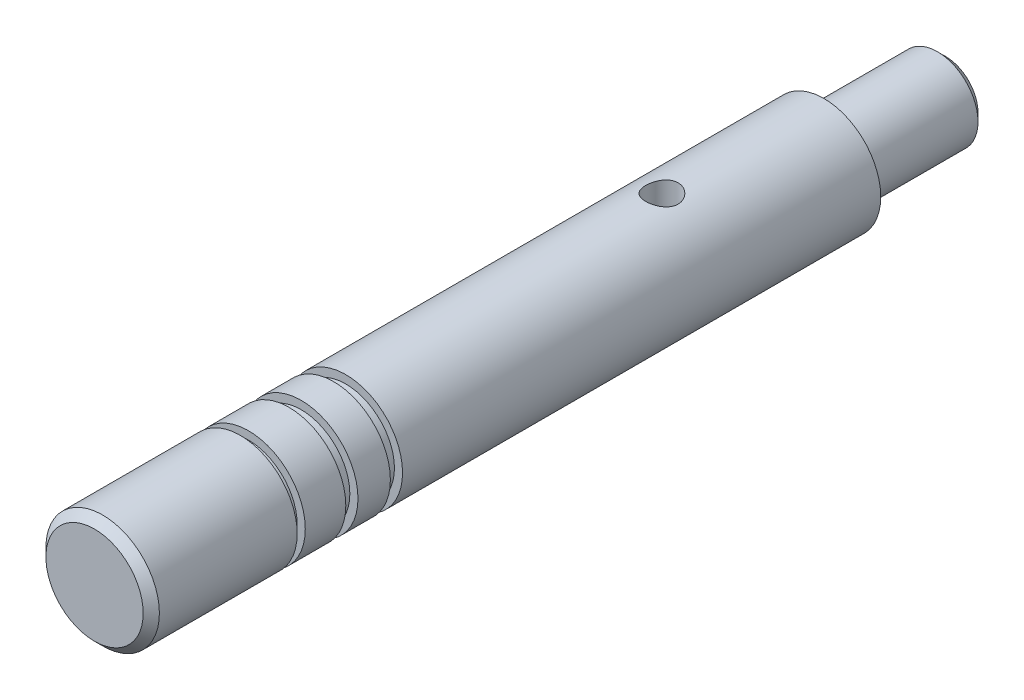
ISO-10303-21;
HEADER;
FILE_DESCRIPTION(('STEP AP214'),'2;1');
FILE_NAME('part.step','',(''),(''),'','','');
FILE_SCHEMA(('AUTOMOTIVE_DESIGN { 1 0 10303 214 1 1 1 1 }'));
ENDSEC;
DATA;
#1=APPLICATION_CONTEXT('core data for automotive mechanical design processes');
#2=APPLICATION_PROTOCOL_DEFINITION('international standard','automotive_design',2000,#1);
#3=PRODUCT_CONTEXT('',#1,'mechanical');
#4=PRODUCT('Part','Part','',(#3));
#5=PRODUCT_RELATED_PRODUCT_CATEGORY('part','',(#4));
#6=PRODUCT_DEFINITION_FORMATION('','',#4);
#7=PRODUCT_DEFINITION_CONTEXT('part definition',#1,'design');
#8=PRODUCT_DEFINITION('design','',#6,#7);
#9=PRODUCT_DEFINITION_SHAPE('','',#8);
#10=(LENGTH_UNIT() NAMED_UNIT(*) SI_UNIT(.MILLI.,.METRE.));
#11=(NAMED_UNIT(*) PLANE_ANGLE_UNIT() SI_UNIT($,.RADIAN.));
#12=(NAMED_UNIT(*) SI_UNIT($,.STERADIAN.) SOLID_ANGLE_UNIT());
#13=UNCERTAINTY_MEASURE_WITH_UNIT(LENGTH_MEASURE(1.E-05),#10,'distance_accuracy_value','');
#14=(GEOMETRIC_REPRESENTATION_CONTEXT(3) GLOBAL_UNCERTAINTY_ASSIGNED_CONTEXT((#13)) GLOBAL_UNIT_ASSIGNED_CONTEXT((#10,
#11,#12)) REPRESENTATION_CONTEXT('',''));
#15=CARTESIAN_POINT('',(0.,0.,0.));
#16=DIRECTION('',(0.,0.,1.));
#17=DIRECTION('',(1.,0.,0.));
#18=AXIS2_PLACEMENT_3D('',#15,#16,#17);
#19=CARTESIAN_POINT('',(0.,0.,7.5));
#20=DIRECTION('',(0.,0.,-1.));
#21=DIRECTION('',(-1.,0.,0.));
#22=AXIS2_PLACEMENT_3D('',#19,#20,#21);
#23=CYLINDRICAL_SURFACE('',#22,2.5);
#24=CARTESIAN_POINT('',(0.,0.,0.499999999999997));
#25=DIRECTION('',(0.,0.,1.));
#26=DIRECTION('',(1.,0.,0.));
#27=AXIS2_PLACEMENT_3D('',#24,#25,#26);
#28=CIRCLE('',#27,2.5);
#29=CARTESIAN_POINT('',(2.5,0.,0.499999999999997));
#30=VERTEX_POINT('',#29);
#31=EDGE_CURVE('E178',#30,#30,#28,.T.);
#32=ORIENTED_EDGE('',*,*,#31,.T.);
#33=EDGE_LOOP('',(#32));
#34=FACE_BOUND('',#33,.T.);
#35=CARTESIAN_POINT('',(0.,0.,7.5));
#36=DIRECTION('',(0.,0.,1.));
#37=DIRECTION('',(1.,0.,0.));
#38=AXIS2_PLACEMENT_3D('',#35,#36,#37);
#39=CIRCLE('',#38,2.5);
#40=CARTESIAN_POINT('',(2.5,0.,7.5));
#41=VERTEX_POINT('',#40);
#42=EDGE_CURVE('E189',#41,#41,#39,.T.);
#43=ORIENTED_EDGE('',*,*,#42,.F.);
#44=EDGE_LOOP('',(#43));
#45=FACE_BOUND('',#44,.T.);
#46=ADVANCED_FACE('F53',(#34,#45),#23,.T.);
#47=CARTESIAN_POINT('',(0.,0.,0.));
#48=DIRECTION('',(0.,0.,1.));
#49=DIRECTION('',(1.,0.,0.));
#50=AXIS2_PLACEMENT_3D('',#47,#48,#49);
#51=PLANE('',#50);
#52=CARTESIAN_POINT('',(0.,0.,0.));
#53=DIRECTION('',(0.,0.,1.));
#54=DIRECTION('',(1.,0.,0.));
#55=AXIS2_PLACEMENT_3D('',#52,#53,#54);
#56=CIRCLE('',#55,2.);
#57=CARTESIAN_POINT('',(2.,0.,0.));
#58=VERTEX_POINT('',#57);
#59=EDGE_CURVE('E176',#58,#58,#56,.F.);
#60=ORIENTED_EDGE('',*,*,#59,.T.);
#61=EDGE_LOOP('',(#60));
#62=FACE_BOUND('',#61,.T.);
#63=ADVANCED_FACE('F153',(#62),#51,.F.);
#64=CARTESIAN_POINT('',(0.,0.,37.));
#65=DIRECTION('',(0.,0.,-1.));
#66=DIRECTION('',(-1.,0.,0.));
#67=AXIS2_PLACEMENT_3D('',#64,#65,#66);
#68=CYLINDRICAL_SURFACE('',#67,3.5);
#69=CARTESIAN_POINT('',(0.,-3.5,18.5));
#70=CARTESIAN_POINT('',(0.054977451188627,-3.49999934647171,18.499999030219));
#71=CARTESIAN_POINT('',(0.109964873936292,-3.49869208701023,18.4954511055119));
#72=CARTESIAN_POINT('',(0.218345995598496,-3.49360452972549,18.4774178649488));
#73=CARTESIAN_POINT('',(0.271739083414809,-3.48982329605034,18.463929166963));
#74=CARTESIAN_POINT('',(0.375352150368937,-3.48020345674544,18.4284959807917));
#75=CARTESIAN_POINT('',(0.425576440424115,-3.474367720532,18.406563281924));
#76=CARTESIAN_POINT('',(0.521634380564636,-3.46124989158242,18.3549110042608));
#77=CARTESIAN_POINT('',(0.567467570589079,-3.45396764753901,18.3251906107549));
#78=CARTESIAN_POINT('',(0.65464722342948,-3.43852367312902,18.2579824946635));
#79=CARTESIAN_POINT('',(0.695861861190492,-3.4303452097302,18.2203276230722));
#80=CARTESIAN_POINT('',(0.771485678962157,-3.41413367457396,18.1386761284313));
#81=CARTESIAN_POINT('',(0.805893838538839,-3.40610062478084,18.0946785561844));
#82=CARTESIAN_POINT('',(0.86759895003223,-3.39091507439313,18.000503208604));
#83=CARTESIAN_POINT('',(0.894739105517031,-3.38378351259108,17.9502190074655));
#84=CARTESIAN_POINT('',(0.940125852769618,-3.37145671914235,17.8455639941267));
#85=CARTESIAN_POINT('',(0.958374357777526,-3.36626107099663,17.7911940639724));
#86=CARTESIAN_POINT('',(0.984992165068878,-3.35856804120241,17.6813826184159));
#87=CARTESIAN_POINT('',(0.993602766016077,-3.35600489366891,17.6260043186009));
#88=CARTESIAN_POINT('',(1.00145333894795,-3.35367104182518,17.5145344257584));
#89=CARTESIAN_POINT('',(1.00069534704803,-3.35389973075333,17.4584429903669));
#90=CARTESIAN_POINT('',(0.990020673813955,-3.35706517184156,17.3490656942732));
#91=CARTESIAN_POINT('',(0.980401628641808,-3.35991391343389,17.29574782441));
#92=CARTESIAN_POINT('',(0.9527569304291,-3.36785674196985,17.1915163901859));
#93=CARTESIAN_POINT('',(0.934730517406292,-3.37295103189705,17.1406030436397));
#94=CARTESIAN_POINT('',(0.890553405689022,-3.38488431756517,17.0418768777842));
#95=CARTESIAN_POINT('',(0.864302755864397,-3.39174458202416,16.9941114637992));
#96=CARTESIAN_POINT('',(0.804491895839434,-3.40642608441438,16.9035617193933));
#97=CARTESIAN_POINT('',(0.770930058366727,-3.41424753611067,16.8607785011325));
#98=CARTESIAN_POINT('',(0.695951998365102,-3.43033125328062,16.7797138121968));
#99=CARTESIAN_POINT('',(0.654287437422664,-3.43859902286152,16.7416627620164));
#100=CARTESIAN_POINT('',(0.565066141193115,-3.45438123609203,16.6730369981799));
#101=CARTESIAN_POINT('',(0.517509100740948,-3.46189564068921,16.6424626719791));
#102=CARTESIAN_POINT('',(0.417461536545724,-3.47538264032742,16.589535632613));
#103=CARTESIAN_POINT('',(0.364944908905004,-3.48134637748612,16.5672298565979));
#104=CARTESIAN_POINT('',(0.256696614983735,-3.49099625743795,16.5318330542916));
#105=CARTESIAN_POINT('',(0.200965762905074,-3.49468297428128,16.5187397053774));
#106=CARTESIAN_POINT('',(0.0898331943221754,-3.49927437257336,16.5025133571453));
#107=CARTESIAN_POINT('',(0.0344806734302543,-3.50026636425301,16.4990676523135));
#108=CARTESIAN_POINT('',(-0.07601326340279,-3.49961042353544,16.5013636331505));
#109=CARTESIAN_POINT('',(-0.131154703878551,-3.49796280790309,16.507104216423));
#110=CARTESIAN_POINT('',(-0.238509316715158,-3.49226963342609,16.5273552221581));
#111=CARTESIAN_POINT('',(-0.290759105867427,-3.48827306508862,16.5416865906617));
#112=CARTESIAN_POINT('',(-0.392104343102815,-3.4783399937092,16.5785002509923));
#113=CARTESIAN_POINT('',(-0.441199425624337,-3.47240326632854,16.6009834854446));
#114=CARTESIAN_POINT('',(-0.536020842560037,-3.45904980584657,16.6540116683226));
#115=CARTESIAN_POINT('',(-0.581651243270127,-3.45160381589487,16.6847205994129));
#116=CARTESIAN_POINT('',(-0.667219264029654,-3.43608973548903,16.7531262529753));
#117=CARTESIAN_POINT('',(-0.707155585421214,-3.42802150376367,16.7908245650314));
#118=CARTESIAN_POINT('',(-0.781553214170353,-3.41184309815947,16.8736046710256));
#119=CARTESIAN_POINT('',(-0.815792713704769,-3.40374018433795,16.9188876377828));
#120=CARTESIAN_POINT('',(-0.87619765803258,-3.38869447362751,17.014731294309));
#121=CARTESIAN_POINT('',(-0.902363383738854,-3.3817516363796,17.0652918003732));
#122=CARTESIAN_POINT('',(-0.945687270594171,-3.36989325638715,17.1700456054959));
#123=CARTESIAN_POINT('',(-0.962893166212216,-3.36496700079018,17.2242178817863));
#124=CARTESIAN_POINT('',(-0.987897250353704,-3.35771228398834,17.3348549678272));
#125=CARTESIAN_POINT('',(-0.995698289511611,-3.35538303564047,17.391319077551));
#126=CARTESIAN_POINT('',(-1.00149012123096,-3.35365851547575,17.5026480164608));
#127=CARTESIAN_POINT('',(-0.999840138221141,-3.35415580399703,17.5574927522763));
#128=CARTESIAN_POINT('',(-0.987623554788214,-3.35777298607399,17.6660873653329));
#129=CARTESIAN_POINT('',(-0.977057251899602,-3.36089279211716,17.7198372790465));
#130=CARTESIAN_POINT('',(-0.947529844083143,-3.36933488579116,17.8241891855838));
#131=CARTESIAN_POINT('',(-0.928655458931764,-3.37463438524179,17.8748176935054));
#132=CARTESIAN_POINT('',(-0.88311474650797,-3.38683651421364,17.9722293672462));
#133=CARTESIAN_POINT('',(-0.856447040215778,-3.3937394274128,18.0190118506367));
#134=CARTESIAN_POINT('',(-0.795032732674124,-3.40865834474881,18.1090917609026));
#135=CARTESIAN_POINT('',(-0.760046138613654,-3.41670381589509,18.152220695671));
#136=CARTESIAN_POINT('',(-0.683429920189676,-3.43284922546139,18.2321119479049));
#137=CARTESIAN_POINT('',(-0.641798625364279,-3.4409491770859,18.2688726595554));
#138=CARTESIAN_POINT('',(-0.551787160432695,-3.45653979786176,18.3359185921633));
#139=CARTESIAN_POINT('',(-0.50326125117989,-3.46400950518705,18.3660134936348));
#140=CARTESIAN_POINT('',(-0.40162526482333,-3.47725697888987,18.417572892511));
#141=CARTESIAN_POINT('',(-0.348517712057369,-3.48303566935144,18.4390421059665));
#142=CARTESIAN_POINT('',(-0.246458157667516,-3.49163672362653,18.4704237756977));
#143=CARTESIAN_POINT('',(-0.197881503812194,-3.49474842181038,18.4814867683423));
#144=CARTESIAN_POINT('',(-0.0995391843931823,-3.49893021926074,18.4962748286211));
#145=CARTESIAN_POINT('',(-0.0497736788080446,-3.50000059166997,18.5000008779884));
#146=CARTESIAN_POINT('',(0.,-3.5,18.5));
#147=B_SPLINE_CURVE_WITH_KNOTS('',3,(#69,#70,#71,#72,#73,#74,#75,#76,#77,#78,#79,#80,#81,#82,
#83,#84,#85,#86,#87,#88,#89,#90,#91,#92,#93,#94,#95,#96,#97,#98,#99,#100,#101,#102,#103,#104,
#105,#106,#107,#108,#109,#110,#111,#112,#113,#114,#115,#116,#117,#118,#119,#120,#121,#122,#123,
#124,#125,#126,#127,#128,#129,#130,#131,#132,#133,#134,#135,#136,#137,#138,#139,#140,#141,#142,
#143,#144,#145,#146),.UNSPECIFIED.,.T.,.F.,(4,2,2,2,2,2,2,2,2,2,2,2,2,2,2,2,2,2,2,2,2,2,2,2,2,2,
2,2,2,2,2,2,2,2,2,2,2,2,4),(0.,0.164749656271172,0.32956166989759,0.494144406447672,
0.65874436771758,0.827239057653908,0.995758989368569,1.16766537650029,1.33953475772405,
1.50699754929408,1.67442394611628,1.83642392910678,1.99843855889074,2.16250401641617,
2.32660602784683,2.49689250297262,2.66718780073736,2.83843550548236,3.00964002003318,
3.17522728845112,3.34079468713336,3.50302570235771,3.66527548283776,3.83103762668237,
3.99683751589905,4.16806052438179,4.33927757478661,4.50957286677749,4.6798165288708,
4.8436334080145,5.00744482086203,5.16958548138845,5.33175484992002,5.49933828438395,
5.66696391547449,5.83888989478295,6.01072174610257,6.15989734012186,6.30905297207072),.UNSPECIFIED.);
#148=CARTESIAN_POINT('',(0.,-3.5,18.5));
#149=VERTEX_POINT('',#148);
#150=EDGE_CURVE('E10',#149,#149,#147,.T.);
#151=ORIENTED_EDGE('',*,*,#150,.T.);
#152=EDGE_LOOP('',(#151));
#153=FACE_BOUND('',#152,.T.);
#154=CARTESIAN_POINT('',(0.,3.5,18.5));
#155=CARTESIAN_POINT('',(-0.0549774511886257,3.49999934647171,18.499999030219));
#156=CARTESIAN_POINT('',(-0.109964873936291,3.49869208701023,18.4954511055119));
#157=CARTESIAN_POINT('',(-0.218345995598495,3.49360452972549,18.4774178649488));
#158=CARTESIAN_POINT('',(-0.271739083414808,3.48982329605034,18.463929166963));
#159=CARTESIAN_POINT('',(-0.375352150368936,3.48020345674544,18.4284959807917));
#160=CARTESIAN_POINT('',(-0.425576440424114,3.474367720532,18.406563281924));
#161=CARTESIAN_POINT('',(-0.521634380564634,3.46124989158242,18.3549110042608));
#162=CARTESIAN_POINT('',(-0.567467570589077,3.45396764753901,18.3251906107549));
#163=CARTESIAN_POINT('',(-0.654647223429478,3.43852367312902,18.2579824946635));
#164=CARTESIAN_POINT('',(-0.69586186119049,3.4303452097302,18.2203276230722));
#165=CARTESIAN_POINT('',(-0.771485678962154,3.41413367457396,18.1386761284313));
#166=CARTESIAN_POINT('',(-0.805893838538837,3.40610062478085,18.0946785561844));
#167=CARTESIAN_POINT('',(-0.867598950032227,3.39091507439313,18.000503208604));
#168=CARTESIAN_POINT('',(-0.894739105517028,3.38378351259108,17.9502190074655));
#169=CARTESIAN_POINT('',(-0.940125852769616,3.37145671914235,17.8455639941267));
#170=CARTESIAN_POINT('',(-0.958374357777524,3.36626107099664,17.7911940639724));
#171=CARTESIAN_POINT('',(-0.984992165068876,3.35856804120241,17.6813826184159));
#172=CARTESIAN_POINT('',(-0.993602766016074,3.35600489366891,17.6260043186009));
#173=CARTESIAN_POINT('',(-1.00145333894795,3.35367104182518,17.5145344257584));
#174=CARTESIAN_POINT('',(-1.00069534704803,3.35389973075333,17.4584429903668));
#175=CARTESIAN_POINT('',(-0.990020673813952,3.35706517184156,17.3490656942732));
#176=CARTESIAN_POINT('',(-0.980401628641805,3.35991391343389,17.29574782441));
#177=CARTESIAN_POINT('',(-0.952756930429096,3.36785674196985,17.1915163901859));
#178=CARTESIAN_POINT('',(-0.934730517406288,3.37295103189706,17.1406030436397));
#179=CARTESIAN_POINT('',(-0.890553405689019,3.38488431756517,17.0418768777842));
#180=CARTESIAN_POINT('',(-0.864302755864395,3.39174458202416,16.9941114637992));
#181=CARTESIAN_POINT('',(-0.804491895839434,3.40642608441438,16.9035617193933));
#182=CARTESIAN_POINT('',(-0.770930058366726,3.41424753611068,16.8607785011325));
#183=CARTESIAN_POINT('',(-0.6959519983651,3.43033125328062,16.7797138121968));
#184=CARTESIAN_POINT('',(-0.654287437422661,3.43859902286152,16.7416627620164));
#185=CARTESIAN_POINT('',(-0.565066141193111,3.45438123609203,16.6730369981799));
#186=CARTESIAN_POINT('',(-0.517509100740943,3.46189564068921,16.6424626719791));
#187=CARTESIAN_POINT('',(-0.417461536545719,3.47538264032743,16.589535632613));
#188=CARTESIAN_POINT('',(-0.364944908904999,3.48134637748612,16.5672298565979));
#189=CARTESIAN_POINT('',(-0.256696614983731,3.49099625743795,16.5318330542916));
#190=CARTESIAN_POINT('',(-0.200965762905069,3.49468297428128,16.5187397053774));
#191=CARTESIAN_POINT('',(-0.0898331943221709,3.49927437257336,16.5025133571453));
#192=CARTESIAN_POINT('',(-0.0344806734302498,3.50026636425301,16.4990676523135));
#193=CARTESIAN_POINT('',(0.0760132634027944,3.49961042353544,16.5013636331505));
#194=CARTESIAN_POINT('',(0.131154703878556,3.49796280790308,16.507104216423));
#195=CARTESIAN_POINT('',(0.238509316715162,3.49226963342609,16.5273552221581));
#196=CARTESIAN_POINT('',(0.290759105867431,3.48827306508862,16.5416865906617));
#197=CARTESIAN_POINT('',(0.392104343102818,3.4783399937092,16.5785002509923));
#198=CARTESIAN_POINT('',(0.44119942562434,3.47240326632854,16.6009834854446));
#199=CARTESIAN_POINT('',(0.53602084256004,3.45904980584657,16.6540116683226));
#200=CARTESIAN_POINT('',(0.581651243270131,3.45160381589487,16.6847205994129));
#201=CARTESIAN_POINT('',(0.667219264029658,3.43608973548903,16.7531262529753));
#202=CARTESIAN_POINT('',(0.707155585421218,3.42802150376367,16.7908245650314));
#203=CARTESIAN_POINT('',(0.781553214170356,3.41184309815947,16.8736046710256));
#204=CARTESIAN_POINT('',(0.815792713704772,3.40374018433795,16.9188876377828));
#205=CARTESIAN_POINT('',(0.876197658032583,3.38869447362751,17.014731294309));
#206=CARTESIAN_POINT('',(0.902363383738857,3.3817516363796,17.0652918003732));
#207=CARTESIAN_POINT('',(0.945687270594174,3.36989325638715,17.1700456054959));
#208=CARTESIAN_POINT('',(0.962893166212219,3.36496700079018,17.2242178817863));
#209=CARTESIAN_POINT('',(0.987897250353707,3.35771228398834,17.3348549678272));
#210=CARTESIAN_POINT('',(0.995698289511614,3.35538303564046,17.391319077551));
#211=CARTESIAN_POINT('',(1.00149012123096,3.35365851547575,17.5026480164608));
#212=CARTESIAN_POINT('',(0.999840138221144,3.35415580399703,17.5574927522763));
#213=CARTESIAN_POINT('',(0.987623554788218,3.35777298607399,17.6660873653329));
#214=CARTESIAN_POINT('',(0.977057251899605,3.36089279211716,17.7198372790465));
#215=CARTESIAN_POINT('',(0.947529844083144,3.36933488579116,17.8241891855838));
#216=CARTESIAN_POINT('',(0.928655458931764,3.37463438524179,17.8748176935054));
#217=CARTESIAN_POINT('',(0.883114746507969,3.38683651421364,17.9722293672462));
#218=CARTESIAN_POINT('',(0.856447040215778,3.3937394274128,18.0190118506367));
#219=CARTESIAN_POINT('',(0.795032732674124,3.40865834474881,18.1090917609026));
#220=CARTESIAN_POINT('',(0.760046138613655,3.41670381589509,18.152220695671));
#221=CARTESIAN_POINT('',(0.683429920189677,3.43284922546139,18.2321119479049));
#222=CARTESIAN_POINT('',(0.641798625364281,3.4409491770859,18.2688726595554));
#223=CARTESIAN_POINT('',(0.551787160432697,3.45653979786176,18.3359185921633));
#224=CARTESIAN_POINT('',(0.503261251179891,3.46400950518705,18.3660134936348));
#225=CARTESIAN_POINT('',(0.401625264823331,3.47725697888987,18.417572892511));
#226=CARTESIAN_POINT('',(0.348517712057369,3.48303566935144,18.4390421059665));
#227=CARTESIAN_POINT('',(0.246458157667517,3.49163672362653,18.4704237756977));
#228=CARTESIAN_POINT('',(0.197881503812195,3.49474842181038,18.4814867683423));
#229=CARTESIAN_POINT('',(0.0995391843931835,3.49893021926074,18.4962748286211));
#230=CARTESIAN_POINT('',(0.0497736788080458,3.50000059166997,18.5000008779884));
#231=CARTESIAN_POINT('',(0.,3.5,18.5));
#232=B_SPLINE_CURVE_WITH_KNOTS('',3,(#154,#155,#156,#157,#158,#159,#160,#161,#162,#163,#164,
#165,#166,#167,#168,#169,#170,#171,#172,#173,#174,#175,#176,#177,#178,#179,#180,#181,#182,#183,
#184,#185,#186,#187,#188,#189,#190,#191,#192,#193,#194,#195,#196,#197,#198,#199,#200,#201,#202,
#203,#204,#205,#206,#207,#208,#209,#210,#211,#212,#213,#214,#215,#216,#217,#218,#219,#220,#221,
#222,#223,#224,#225,#226,#227,#228,#229,#230,#231),.UNSPECIFIED.,.T.,.F.,(4,2,2,2,2,2,2,2,2,2,2,
2,2,2,2,2,2,2,2,2,2,2,2,2,2,2,2,2,2,2,2,2,2,2,2,2,2,2,4),(0.,0.164749656271172,0.32956166989759,
0.494144406447672,0.65874436771758,0.827239057653907,0.995758989368568,1.16766537650029,
1.33953475772405,1.50699754929408,1.67442394611628,1.83642392910678,1.99843855889075,
2.16250401641616,2.32660602784683,2.49689250297262,2.66718780073736,2.83843550548236,
3.00964002003318,3.17522728845112,3.34079468713336,3.50302570235771,3.66527548283776,
3.83103762668237,3.99683751589905,4.16806052438179,4.33927757478661,4.50957286677749,
4.6798165288708,4.84363340801449,5.00744482086203,5.16958548138846,5.33175484992002,
5.49933828438395,5.66696391547449,5.83888989478295,6.01072174610257,6.15989734012186,
6.30905297207072),.UNSPECIFIED.);
#233=CARTESIAN_POINT('',(0.,3.5,18.5));
#234=VERTEX_POINT('',#233);
#235=EDGE_CURVE('E67',#234,#234,#232,.T.);
#236=ORIENTED_EDGE('',*,*,#235,.T.);
#237=EDGE_LOOP('',(#236));
#238=FACE_BOUND('',#237,.T.);
#239=CARTESIAN_POINT('',(0.,0.,37.));
#240=DIRECTION('',(0.,0.,1.));
#241=DIRECTION('',(1.,0.,0.));
#242=AXIS2_PLACEMENT_3D('',#239,#240,#241);
#243=CIRCLE('',#242,3.5);
#244=CARTESIAN_POINT('',(3.5,0.,37.));
#245=VERTEX_POINT('',#244);
#246=EDGE_CURVE('E197',#245,#245,#243,.T.);
#247=ORIENTED_EDGE('',*,*,#246,.F.);
#248=EDGE_LOOP('',(#247));
#249=FACE_BOUND('',#248,.T.);
#250=CARTESIAN_POINT('',(0.,0.,7.5));
#251=DIRECTION('',(0.,0.,1.));
#252=DIRECTION('',(1.,0.,0.));
#253=AXIS2_PLACEMENT_3D('',#250,#251,#252);
#254=CIRCLE('',#253,3.5);
#255=CARTESIAN_POINT('',(3.5,0.,7.5));
#256=VERTEX_POINT('',#255);
#257=EDGE_CURVE('E198',#256,#256,#254,.T.);
#258=ORIENTED_EDGE('',*,*,#257,.T.);
#259=EDGE_LOOP('',(#258));
#260=FACE_BOUND('',#259,.T.);
#261=ADVANCED_FACE('F83',(#153,#238,#249,#260),#68,.T.);
#262=CARTESIAN_POINT('',(0.,0.,37.));
#263=DIRECTION('',(0.,0.,1.));
#264=DIRECTION('',(1.,0.,0.));
#265=AXIS2_PLACEMENT_3D('',#262,#263,#264);
#266=PLANE('',#265);
#267=CARTESIAN_POINT('',(0.,0.,37.));
#268=DIRECTION('',(0.,0.,1.));
#269=DIRECTION('',(1.,0.,0.));
#270=AXIS2_PLACEMENT_3D('',#267,#268,#269);
#271=CIRCLE('',#270,3.);
#272=CARTESIAN_POINT('',(3.,0.,37.));
#273=VERTEX_POINT('',#272);
#274=EDGE_CURVE('E196',#273,#273,#271,.T.);
#275=ORIENTED_EDGE('',*,*,#274,.F.);
#276=EDGE_LOOP('',(#275));
#277=FACE_BOUND('',#276,.T.);
#278=ORIENTED_EDGE('',*,*,#246,.T.);
#279=EDGE_LOOP('',(#278));
#280=FACE_BOUND('',#279,.T.);
#281=ADVANCED_FACE('F143',(#277,#280),#266,.T.);
#282=CARTESIAN_POINT('',(0.,0.,7.5));
#283=DIRECTION('',(0.,0.,1.));
#284=DIRECTION('',(1.,0.,0.));
#285=AXIS2_PLACEMENT_3D('',#282,#283,#284);
#286=PLANE('',#285);
#287=ORIENTED_EDGE('',*,*,#42,.T.);
#288=EDGE_LOOP('',(#287));
#289=FACE_BOUND('',#288,.T.);
#290=ORIENTED_EDGE('',*,*,#257,.F.);
#291=EDGE_LOOP('',(#290));
#292=FACE_BOUND('',#291,.T.);
#293=ADVANCED_FACE('F141',(#289,#292),#286,.F.);
#294=CARTESIAN_POINT('',(0.,0.,37.75));
#295=DIRECTION('',(0.,0.,-1.));
#296=DIRECTION('',(-1.,0.,0.));
#297=AXIS2_PLACEMENT_3D('',#294,#295,#296);
#298=CYLINDRICAL_SURFACE('',#297,3.);
#299=CARTESIAN_POINT('',(0.,0.,37.75));
#300=DIRECTION('',(0.,0.,1.));
#301=DIRECTION('',(1.,0.,0.));
#302=AXIS2_PLACEMENT_3D('',#299,#300,#301);
#303=CIRCLE('',#302,3.);
#304=CARTESIAN_POINT('',(3.,0.,37.75));
#305=VERTEX_POINT('',#304);
#306=EDGE_CURVE('E202',#305,#305,#303,.T.);
#307=ORIENTED_EDGE('',*,*,#306,.F.);
#308=EDGE_LOOP('',(#307));
#309=FACE_BOUND('',#308,.T.);
#310=ORIENTED_EDGE('',*,*,#274,.T.);
#311=EDGE_LOOP('',(#310));
#312=FACE_BOUND('',#311,.T.);
#313=ADVANCED_FACE('F137',(#309,#312),#298,.T.);
#314=CARTESIAN_POINT('',(0.,0.,39.75));
#315=DIRECTION('',(0.,0.,-1.));
#316=DIRECTION('',(-1.,0.,0.));
#317=AXIS2_PLACEMENT_3D('',#314,#315,#316);
#318=CYLINDRICAL_SURFACE('',#317,3.5);
#319=CARTESIAN_POINT('',(0.,0.,39.75));
#320=DIRECTION('',(0.,0.,1.));
#321=DIRECTION('',(1.,0.,0.));
#322=AXIS2_PLACEMENT_3D('',#319,#320,#321);
#323=CIRCLE('',#322,3.5);
#324=CARTESIAN_POINT('',(3.5,0.,39.75));
#325=VERTEX_POINT('',#324);
#326=EDGE_CURVE('E212',#325,#325,#323,.T.);
#327=ORIENTED_EDGE('',*,*,#326,.F.);
#328=EDGE_LOOP('',(#327));
#329=FACE_BOUND('',#328,.T.);
#330=CARTESIAN_POINT('',(0.,0.,37.75));
#331=DIRECTION('',(0.,0.,1.));
#332=DIRECTION('',(1.,0.,0.));
#333=AXIS2_PLACEMENT_3D('',#330,#331,#332);
#334=CIRCLE('',#333,3.5);
#335=CARTESIAN_POINT('',(3.5,0.,37.75));
#336=VERTEX_POINT('',#335);
#337=EDGE_CURVE('E213',#336,#336,#334,.T.);
#338=ORIENTED_EDGE('',*,*,#337,.T.);
#339=EDGE_LOOP('',(#338));
#340=FACE_BOUND('',#339,.T.);
#341=ADVANCED_FACE('F130',(#329,#340),#318,.T.);
#342=CARTESIAN_POINT('',(0.,0.,39.75));
#343=DIRECTION('',(0.,0.,1.));
#344=DIRECTION('',(1.,0.,0.));
#345=AXIS2_PLACEMENT_3D('',#342,#343,#344);
#346=PLANE('',#345);
#347=CARTESIAN_POINT('',(0.,0.,39.75));
#348=DIRECTION('',(0.,0.,1.));
#349=DIRECTION('',(1.,0.,0.));
#350=AXIS2_PLACEMENT_3D('',#347,#348,#349);
#351=CIRCLE('',#350,3.);
#352=CARTESIAN_POINT('',(3.,0.,39.75));
#353=VERTEX_POINT('',#352);
#354=EDGE_CURVE('E186',#353,#353,#351,.T.);
#355=ORIENTED_EDGE('',*,*,#354,.F.);
#356=EDGE_LOOP('',(#355));
#357=FACE_BOUND('',#356,.T.);
#358=ORIENTED_EDGE('',*,*,#326,.T.);
#359=EDGE_LOOP('',(#358));
#360=FACE_BOUND('',#359,.T.);
#361=ADVANCED_FACE('F127',(#357,#360),#346,.T.);
#362=CARTESIAN_POINT('',(0.,0.,37.75));
#363=DIRECTION('',(0.,0.,1.));
#364=DIRECTION('',(1.,0.,0.));
#365=AXIS2_PLACEMENT_3D('',#362,#363,#364);
#366=PLANE('',#365);
#367=ORIENTED_EDGE('',*,*,#306,.T.);
#368=EDGE_LOOP('',(#367));
#369=FACE_BOUND('',#368,.T.);
#370=ORIENTED_EDGE('',*,*,#337,.F.);
#371=EDGE_LOOP('',(#370));
#372=FACE_BOUND('',#371,.T.);
#373=ADVANCED_FACE('F125',(#369,#372),#366,.F.);
#374=CARTESIAN_POINT('',(0.,0.,40.5));
#375=DIRECTION('',(0.,0.,-1.));
#376=DIRECTION('',(-1.,0.,0.));
#377=AXIS2_PLACEMENT_3D('',#374,#375,#376);
#378=CYLINDRICAL_SURFACE('',#377,3.);
#379=CARTESIAN_POINT('',(0.,0.,40.5));
#380=DIRECTION('',(0.,0.,1.));
#381=DIRECTION('',(1.,0.,0.));
#382=AXIS2_PLACEMENT_3D('',#379,#380,#381);
#383=CIRCLE('',#382,3.);
#384=CARTESIAN_POINT('',(3.,0.,40.5));
#385=VERTEX_POINT('',#384);
#386=EDGE_CURVE('E217',#385,#385,#383,.T.);
#387=ORIENTED_EDGE('',*,*,#386,.F.);
#388=EDGE_LOOP('',(#387));
#389=FACE_BOUND('',#388,.T.);
#390=ORIENTED_EDGE('',*,*,#354,.T.);
#391=EDGE_LOOP('',(#390));
#392=FACE_BOUND('',#391,.T.);
#393=ADVANCED_FACE('F121',(#389,#392),#378,.T.);
#394=CARTESIAN_POINT('',(0.,0.,43.));
#395=DIRECTION('',(0.,0.,-1.));
#396=DIRECTION('',(-1.,0.,0.));
#397=AXIS2_PLACEMENT_3D('',#394,#395,#396);
#398=CYLINDRICAL_SURFACE('',#397,3.5);
#399=CARTESIAN_POINT('',(0.,0.,43.));
#400=DIRECTION('',(0.,0.,1.));
#401=DIRECTION('',(1.,0.,0.));
#402=AXIS2_PLACEMENT_3D('',#399,#400,#401);
#403=CIRCLE('',#402,3.5);
#404=CARTESIAN_POINT('',(3.5,0.,43.));
#405=VERTEX_POINT('',#404);
#406=EDGE_CURVE('E227',#405,#405,#403,.T.);
#407=ORIENTED_EDGE('',*,*,#406,.F.);
#408=EDGE_LOOP('',(#407));
#409=FACE_BOUND('',#408,.T.);
#410=CARTESIAN_POINT('',(0.,0.,40.5));
#411=DIRECTION('',(0.,0.,1.));
#412=DIRECTION('',(1.,0.,0.));
#413=AXIS2_PLACEMENT_3D('',#410,#411,#412);
#414=CIRCLE('',#413,3.5);
#415=CARTESIAN_POINT('',(3.5,0.,40.5));
#416=VERTEX_POINT('',#415);
#417=EDGE_CURVE('E228',#416,#416,#414,.T.);
#418=ORIENTED_EDGE('',*,*,#417,.T.);
#419=EDGE_LOOP('',(#418));
#420=FACE_BOUND('',#419,.T.);
#421=ADVANCED_FACE('F114',(#409,#420),#398,.T.);
#422=CARTESIAN_POINT('',(0.,0.,43.));
#423=DIRECTION('',(0.,0.,1.));
#424=DIRECTION('',(1.,0.,0.));
#425=AXIS2_PLACEMENT_3D('',#422,#423,#424);
#426=PLANE('',#425);
#427=CARTESIAN_POINT('',(0.,0.,43.));
#428=DIRECTION('',(0.,0.,1.));
#429=DIRECTION('',(1.,0.,0.));
#430=AXIS2_PLACEMENT_3D('',#427,#428,#429);
#431=CIRCLE('',#430,3.);
#432=CARTESIAN_POINT('',(3.,0.,43.));
#433=VERTEX_POINT('',#432);
#434=EDGE_CURVE('E180',#433,#433,#431,.T.);
#435=ORIENTED_EDGE('',*,*,#434,.F.);
#436=EDGE_LOOP('',(#435));
#437=FACE_BOUND('',#436,.T.);
#438=ORIENTED_EDGE('',*,*,#406,.T.);
#439=EDGE_LOOP('',(#438));
#440=FACE_BOUND('',#439,.T.);
#441=ADVANCED_FACE('F111',(#437,#440),#426,.T.);
#442=CARTESIAN_POINT('',(0.,0.,40.5));
#443=DIRECTION('',(0.,0.,1.));
#444=DIRECTION('',(1.,0.,0.));
#445=AXIS2_PLACEMENT_3D('',#442,#443,#444);
#446=PLANE('',#445);
#447=ORIENTED_EDGE('',*,*,#386,.T.);
#448=EDGE_LOOP('',(#447));
#449=FACE_BOUND('',#448,.T.);
#450=ORIENTED_EDGE('',*,*,#417,.F.);
#451=EDGE_LOOP('',(#450));
#452=FACE_BOUND('',#451,.T.);
#453=ADVANCED_FACE('F109',(#449,#452),#446,.F.);
#454=CARTESIAN_POINT('',(0.,0.,43.5));
#455=DIRECTION('',(0.,0.,-1.));
#456=DIRECTION('',(-1.,0.,0.));
#457=AXIS2_PLACEMENT_3D('',#454,#455,#456);
#458=CYLINDRICAL_SURFACE('',#457,3.);
#459=CARTESIAN_POINT('',(0.,0.,43.5));
#460=DIRECTION('',(0.,0.,1.));
#461=DIRECTION('',(1.,0.,0.));
#462=AXIS2_PLACEMENT_3D('',#459,#460,#461);
#463=CIRCLE('',#462,3.);
#464=CARTESIAN_POINT('',(3.,0.,43.5));
#465=VERTEX_POINT('',#464);
#466=EDGE_CURVE('E232',#465,#465,#463,.T.);
#467=ORIENTED_EDGE('',*,*,#466,.F.);
#468=EDGE_LOOP('',(#467));
#469=FACE_BOUND('',#468,.T.);
#470=ORIENTED_EDGE('',*,*,#434,.T.);
#471=EDGE_LOOP('',(#470));
#472=FACE_BOUND('',#471,.T.);
#473=ADVANCED_FACE('F105',(#469,#472),#458,.T.);
#474=CARTESIAN_POINT('',(0.,0.,52.5));
#475=DIRECTION('',(0.,0.,-1.));
#476=DIRECTION('',(-1.,0.,0.));
#477=AXIS2_PLACEMENT_3D('',#474,#475,#476);
#478=CYLINDRICAL_SURFACE('',#477,3.5);
#479=CARTESIAN_POINT('',(0.,0.,52.));
#480=DIRECTION('',(0.,0.,1.));
#481=DIRECTION('',(1.,0.,0.));
#482=AXIS2_PLACEMENT_3D('',#479,#480,#481);
#483=CIRCLE('',#482,3.5);
#484=CARTESIAN_POINT('',(3.5,0.,52.));
#485=VERTEX_POINT('',#484);
#486=EDGE_CURVE('E72',#485,#485,#483,.F.);
#487=ORIENTED_EDGE('',*,*,#486,.T.);
#488=EDGE_LOOP('',(#487));
#489=FACE_BOUND('',#488,.T.);
#490=CARTESIAN_POINT('',(0.,0.,43.5));
#491=DIRECTION('',(0.,0.,1.));
#492=DIRECTION('',(1.,0.,0.));
#493=AXIS2_PLACEMENT_3D('',#490,#491,#492);
#494=CIRCLE('',#493,3.5);
#495=CARTESIAN_POINT('',(3.5,0.,43.5));
#496=VERTEX_POINT('',#495);
#497=EDGE_CURVE('E239',#496,#496,#494,.T.);
#498=ORIENTED_EDGE('',*,*,#497,.T.);
#499=EDGE_LOOP('',(#498));
#500=FACE_BOUND('',#499,.T.);
#501=ADVANCED_FACE('F97',(#489,#500),#478,.T.);
#502=CARTESIAN_POINT('',(0.,0.,52.5));
#503=DIRECTION('',(0.,0.,1.));
#504=DIRECTION('',(1.,0.,0.));
#505=AXIS2_PLACEMENT_3D('',#502,#503,#504);
#506=PLANE('',#505);
#507=CARTESIAN_POINT('',(0.,0.,52.5));
#508=DIRECTION('',(0.,0.,1.));
#509=DIRECTION('',(1.,0.,0.));
#510=AXIS2_PLACEMENT_3D('',#507,#508,#509);
#511=CIRCLE('',#510,2.99999999999999);
#512=CARTESIAN_POINT('',(2.99999999999999,0.,52.5));
#513=VERTEX_POINT('',#512);
#514=EDGE_CURVE('E77',#513,#513,#511,.T.);
#515=ORIENTED_EDGE('',*,*,#514,.T.);
#516=EDGE_LOOP('',(#515));
#517=FACE_BOUND('',#516,.T.);
#518=ADVANCED_FACE('F92',(#517),#506,.T.);
#519=CARTESIAN_POINT('',(0.,0.,43.5));
#520=DIRECTION('',(0.,0.,1.));
#521=DIRECTION('',(1.,0.,0.));
#522=AXIS2_PLACEMENT_3D('',#519,#520,#521);
#523=PLANE('',#522);
#524=ORIENTED_EDGE('',*,*,#466,.T.);
#525=EDGE_LOOP('',(#524));
#526=FACE_BOUND('',#525,.T.);
#527=ORIENTED_EDGE('',*,*,#497,.F.);
#528=EDGE_LOOP('',(#527));
#529=FACE_BOUND('',#528,.T.);
#530=ADVANCED_FACE('F96',(#526,#529),#523,.F.);
#531=CARTESIAN_POINT('',(0.,0.,0.499999999999997));
#532=DIRECTION('',(0.,0.,1.));
#533=DIRECTION('',(1.,0.,0.));
#534=AXIS2_PLACEMENT_3D('',#531,#532,#533);
#535=CONICAL_SURFACE('',#534,2.5,0.78539816339745);
#536=ORIENTED_EDGE('',*,*,#59,.F.);
#537=EDGE_LOOP('',(#536));
#538=FACE_BOUND('',#537,.T.);
#539=ORIENTED_EDGE('',*,*,#31,.F.);
#540=EDGE_LOOP('',(#539));
#541=FACE_BOUND('',#540,.T.);
#542=ADVANCED_FACE('F101',(#538,#541),#535,.T.);
#543=CARTESIAN_POINT('',(0.,0.,52.5));
#544=DIRECTION('',(0.,0.,-1.));
#545=DIRECTION('',(-1.,0.,0.));
#546=AXIS2_PLACEMENT_3D('',#543,#544,#545);
#547=CONICAL_SURFACE('',#546,2.99999999999999,0.785398163397452);
#548=ORIENTED_EDGE('',*,*,#486,.F.);
#549=EDGE_LOOP('',(#548));
#550=FACE_BOUND('',#549,.T.);
#551=ORIENTED_EDGE('',*,*,#514,.F.);
#552=EDGE_LOOP('',(#551));
#553=FACE_BOUND('',#552,.T.);
#554=ADVANCED_FACE('F56',(#550,#553),#547,.T.);
#555=CARTESIAN_POINT('',(0.,-3.5,17.5));
#556=DIRECTION('',(0.,1.,0.));
#557=DIRECTION('',(0.,0.,1.));
#558=AXIS2_PLACEMENT_3D('',#555,#556,#557);
#559=CYLINDRICAL_SURFACE('',#558,1.);
#560=ORIENTED_EDGE('',*,*,#235,.F.);
#561=EDGE_LOOP('',(#560));
#562=FACE_BOUND('',#561,.T.);
#563=ORIENTED_EDGE('',*,*,#150,.F.);
#564=EDGE_LOOP('',(#563));
#565=FACE_BOUND('',#564,.T.);
#566=ADVANCED_FACE('F87',(#562,#565),#559,.F.);
#567=CLOSED_SHELL('',(#46,#63,#261,#281,#293,#313,#341,#361,#373,#393,#421,#441,#453,#473,#501,
#518,#530,#542,#554,#566));
#568=MANIFOLD_SOLID_BREP('B2',#567);
#569=ADVANCED_BREP_SHAPE_REPRESENTATION('',(#18,#568),#14);
#570=SHAPE_DEFINITION_REPRESENTATION(#9,#569);
ENDSEC;
END-ISO-10303-21;
